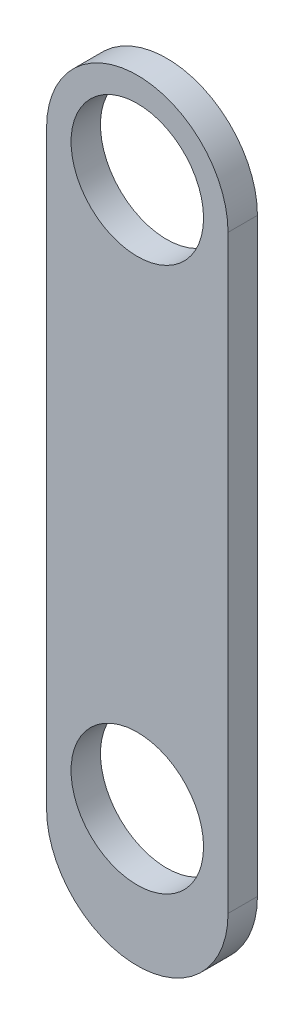
ISO-10303-21;
HEADER;
FILE_DESCRIPTION(('STEP AP214'),'2;1');
FILE_NAME('part.step','',(''),(''),'','','');
FILE_SCHEMA(('AUTOMOTIVE_DESIGN { 1 0 10303 214 1 1 1 1 }'));
ENDSEC;
DATA;
#1=APPLICATION_CONTEXT('core data for automotive mechanical design processes');
#2=APPLICATION_PROTOCOL_DEFINITION('international standard','automotive_design',2000,#1);
#3=PRODUCT_CONTEXT('',#1,'mechanical');
#4=PRODUCT('Part','Part','',(#3));
#5=PRODUCT_RELATED_PRODUCT_CATEGORY('part','',(#4));
#6=PRODUCT_DEFINITION_FORMATION('','',#4);
#7=PRODUCT_DEFINITION_CONTEXT('part definition',#1,'design');
#8=PRODUCT_DEFINITION('design','',#6,#7);
#9=PRODUCT_DEFINITION_SHAPE('','',#8);
#10=(LENGTH_UNIT() NAMED_UNIT(*) SI_UNIT(.MILLI.,.METRE.));
#11=(NAMED_UNIT(*) PLANE_ANGLE_UNIT() SI_UNIT($,.RADIAN.));
#12=(NAMED_UNIT(*) SI_UNIT($,.STERADIAN.) SOLID_ANGLE_UNIT());
#13=UNCERTAINTY_MEASURE_WITH_UNIT(LENGTH_MEASURE(1.E-05),#10,'distance_accuracy_value','');
#14=(GEOMETRIC_REPRESENTATION_CONTEXT(3) GLOBAL_UNCERTAINTY_ASSIGNED_CONTEXT((#13)) GLOBAL_UNIT_ASSIGNED_CONTEXT((#10,
#11,#12)) REPRESENTATION_CONTEXT('',''));
#15=CARTESIAN_POINT('',(0.,0.,0.));
#16=DIRECTION('',(0.,0.,1.));
#17=DIRECTION('',(1.,0.,0.));
#18=AXIS2_PLACEMENT_3D('',#15,#16,#17);
#19=CARTESIAN_POINT('',(12.7,0.,4.1148));
#20=DIRECTION('',(0.,0.,1.));
#21=DIRECTION('',(1.,0.,0.));
#22=AXIS2_PLACEMENT_3D('',#19,#20,#21);
#23=PLANE('',#22);
#24=CARTESIAN_POINT('',(12.7,6.34999999999999,4.1148));
#25=DIRECTION('',(0.,0.,1.));
#26=DIRECTION('',(1.,0.,0.));
#27=AXIS2_PLACEMENT_3D('',#24,#25,#26);
#28=CIRCLE('',#27,9.27099999999999);
#29=CARTESIAN_POINT('',(21.971,6.34999999999999,4.1148));
#30=VERTEX_POINT('',#29);
#31=EDGE_CURVE('E111',#30,#30,#28,.T.);
#32=ORIENTED_EDGE('',*,*,#31,.F.);
#33=EDGE_LOOP('',(#32));
#34=FACE_BOUND('',#33,.T.);
#35=CARTESIAN_POINT('',(12.7,0.,4.1148));
#36=DIRECTION('',(0.,0.,1.));
#37=DIRECTION('',(1.,0.,0.));
#38=AXIS2_PLACEMENT_3D('',#35,#36,#37);
#39=CIRCLE('',#38,12.7);
#40=CARTESIAN_POINT('',(0.,0.,4.1148));
#41=VERTEX_POINT('',#40);
#42=CARTESIAN_POINT('',(25.4,0.,4.1148));
#43=VERTEX_POINT('',#42);
#44=EDGE_CURVE('E96',#41,#43,#39,.T.);
#45=ORIENTED_EDGE('',*,*,#44,.T.);
#46=DIRECTION('',(0.,1.,0.));
#47=VECTOR('',#46,1.);
#48=CARTESIAN_POINT('',(25.4,0.,4.1148));
#49=LINE('',#48,#47);
#50=CARTESIAN_POINT('',(25.4,82.55,4.1148));
#51=VERTEX_POINT('',#50);
#52=EDGE_CURVE('E91',#43,#51,#49,.T.);
#53=ORIENTED_EDGE('',*,*,#52,.T.);
#54=CARTESIAN_POINT('',(12.7,82.55,4.1148));
#55=DIRECTION('',(0.,0.,1.));
#56=DIRECTION('',(1.,0.,0.));
#57=AXIS2_PLACEMENT_3D('',#54,#55,#56);
#58=CIRCLE('',#57,12.7);
#59=CARTESIAN_POINT('',(0.,82.55,4.1148));
#60=VERTEX_POINT('',#59);
#61=EDGE_CURVE('E94',#51,#60,#58,.T.);
#62=ORIENTED_EDGE('',*,*,#61,.T.);
#63=DIRECTION('',(0.,-1.,0.));
#64=VECTOR('',#63,1.);
#65=CARTESIAN_POINT('',(0.,0.,4.1148));
#66=LINE('',#65,#64);
#67=EDGE_CURVE('E61',#60,#41,#66,.T.);
#68=ORIENTED_EDGE('',*,*,#67,.T.);
#69=EDGE_LOOP('',(#45,#53,#62,#68));
#70=FACE_BOUND('',#69,.T.);
#71=CARTESIAN_POINT('',(12.7,82.55,4.1148));
#72=DIRECTION('',(0.,0.,1.));
#73=DIRECTION('',(1.,0.,0.));
#74=AXIS2_PLACEMENT_3D('',#71,#72,#73);
#75=CIRCLE('',#74,9.271);
#76=CARTESIAN_POINT('',(21.971,82.55,4.1148));
#77=VERTEX_POINT('',#76);
#78=EDGE_CURVE('E126',#77,#77,#75,.T.);
#79=ORIENTED_EDGE('',*,*,#78,.F.);
#80=EDGE_LOOP('',(#79));
#81=FACE_BOUND('',#80,.T.);
#82=ADVANCED_FACE('F44',(#34,#70,#81),#23,.T.);
#83=CARTESIAN_POINT('',(12.7,0.,0.));
#84=DIRECTION('',(0.,0.,1.));
#85=DIRECTION('',(1.,0.,0.));
#86=AXIS2_PLACEMENT_3D('',#83,#84,#85);
#87=PLANE('',#86);
#88=CARTESIAN_POINT('',(12.7,0.,0.));
#89=DIRECTION('',(0.,0.,1.));
#90=DIRECTION('',(1.,0.,0.));
#91=AXIS2_PLACEMENT_3D('',#88,#89,#90);
#92=CIRCLE('',#91,12.7);
#93=CARTESIAN_POINT('',(0.,0.,0.));
#94=VERTEX_POINT('',#93);
#95=CARTESIAN_POINT('',(25.4,0.,0.));
#96=VERTEX_POINT('',#95);
#97=EDGE_CURVE('E108',#94,#96,#92,.T.);
#98=ORIENTED_EDGE('',*,*,#97,.F.);
#99=DIRECTION('',(0.,-1.,0.));
#100=VECTOR('',#99,1.);
#101=CARTESIAN_POINT('',(0.,0.,0.));
#102=LINE('',#101,#100);
#103=CARTESIAN_POINT('',(0.,82.55,0.));
#104=VERTEX_POINT('',#103);
#105=EDGE_CURVE('E84',#104,#94,#102,.T.);
#106=ORIENTED_EDGE('',*,*,#105,.F.);
#107=CARTESIAN_POINT('',(12.7,82.55,0.));
#108=DIRECTION('',(0.,0.,1.));
#109=DIRECTION('',(1.,0.,0.));
#110=AXIS2_PLACEMENT_3D('',#107,#108,#109);
#111=CIRCLE('',#110,12.7);
#112=CARTESIAN_POINT('',(25.4,82.55,0.));
#113=VERTEX_POINT('',#112);
#114=EDGE_CURVE('E78',#113,#104,#111,.T.);
#115=ORIENTED_EDGE('',*,*,#114,.F.);
#116=DIRECTION('',(0.,1.,0.));
#117=VECTOR('',#116,1.);
#118=CARTESIAN_POINT('',(25.4,0.,0.));
#119=LINE('',#118,#117);
#120=EDGE_CURVE('E100',#96,#113,#119,.T.);
#121=ORIENTED_EDGE('',*,*,#120,.F.);
#122=EDGE_LOOP('',(#98,#106,#115,#121));
#123=FACE_BOUND('',#122,.T.);
#124=CARTESIAN_POINT('',(12.7,6.34999999999999,0.));
#125=DIRECTION('',(0.,0.,1.));
#126=DIRECTION('',(1.,0.,0.));
#127=AXIS2_PLACEMENT_3D('',#124,#125,#126);
#128=CIRCLE('',#127,9.27099999999999);
#129=CARTESIAN_POINT('',(21.971,6.34999999999999,0.));
#130=VERTEX_POINT('',#129);
#131=EDGE_CURVE('E123',#130,#130,#128,.T.);
#132=ORIENTED_EDGE('',*,*,#131,.T.);
#133=EDGE_LOOP('',(#132));
#134=FACE_BOUND('',#133,.T.);
#135=CARTESIAN_POINT('',(12.7,82.55,0.));
#136=DIRECTION('',(0.,0.,1.));
#137=DIRECTION('',(1.,0.,0.));
#138=AXIS2_PLACEMENT_3D('',#135,#136,#137);
#139=CIRCLE('',#138,9.271);
#140=CARTESIAN_POINT('',(21.971,82.55,0.));
#141=VERTEX_POINT('',#140);
#142=EDGE_CURVE('E129',#141,#141,#139,.T.);
#143=ORIENTED_EDGE('',*,*,#142,.T.);
#144=EDGE_LOOP('',(#143));
#145=FACE_BOUND('',#144,.T.);
#146=ADVANCED_FACE('F119',(#123,#134,#145),#87,.F.);
#147=CARTESIAN_POINT('',(12.7,0.,4.1148));
#148=DIRECTION('',(0.,0.,-1.));
#149=DIRECTION('',(-1.,0.,0.));
#150=AXIS2_PLACEMENT_3D('',#147,#148,#149);
#151=CYLINDRICAL_SURFACE('',#150,12.7);
#152=ORIENTED_EDGE('',*,*,#97,.T.);
#153=DIRECTION('',(0.,0.,-1.));
#154=VECTOR('',#153,1.);
#155=CARTESIAN_POINT('',(25.4,0.,4.1148));
#156=LINE('',#155,#154);
#157=EDGE_CURVE('E11',#43,#96,#156,.T.);
#158=ORIENTED_EDGE('',*,*,#157,.F.);
#159=ORIENTED_EDGE('',*,*,#44,.F.);
#160=DIRECTION('',(0.,0.,-1.));
#161=VECTOR('',#160,1.);
#162=CARTESIAN_POINT('',(0.,0.,4.1148));
#163=LINE('',#162,#161);
#164=EDGE_CURVE('E104',#41,#94,#163,.T.);
#165=ORIENTED_EDGE('',*,*,#164,.T.);
#166=EDGE_LOOP('',(#152,#158,#159,#165));
#167=FACE_BOUND('',#166,.T.);
#168=ADVANCED_FACE('F46',(#167),#151,.T.);
#169=CARTESIAN_POINT('',(25.4,0.,4.1148));
#170=DIRECTION('',(-1.,0.,0.));
#171=DIRECTION('',(0.,-1.,0.));
#172=AXIS2_PLACEMENT_3D('',#169,#170,#171);
#173=PLANE('',#172);
#174=ORIENTED_EDGE('',*,*,#120,.T.);
#175=DIRECTION('',(0.,0.,-1.));
#176=VECTOR('',#175,1.);
#177=CARTESIAN_POINT('',(25.4,82.55,4.1148));
#178=LINE('',#177,#176);
#179=EDGE_CURVE('E53',#51,#113,#178,.T.);
#180=ORIENTED_EDGE('',*,*,#179,.F.);
#181=ORIENTED_EDGE('',*,*,#52,.F.);
#182=ORIENTED_EDGE('',*,*,#157,.T.);
#183=EDGE_LOOP('',(#174,#180,#181,#182));
#184=FACE_BOUND('',#183,.T.);
#185=ADVANCED_FACE('F99',(#184),#173,.F.);
#186=CARTESIAN_POINT('',(12.7,82.55,4.1148));
#187=DIRECTION('',(0.,0.,-1.));
#188=DIRECTION('',(-1.,0.,0.));
#189=AXIS2_PLACEMENT_3D('',#186,#187,#188);
#190=CYLINDRICAL_SURFACE('',#189,12.7);
#191=ORIENTED_EDGE('',*,*,#114,.T.);
#192=DIRECTION('',(0.,0.,-1.));
#193=VECTOR('',#192,1.);
#194=CARTESIAN_POINT('',(0.,82.55,4.1148));
#195=LINE('',#194,#193);
#196=EDGE_CURVE('E101',#60,#104,#195,.T.);
#197=ORIENTED_EDGE('',*,*,#196,.F.);
#198=ORIENTED_EDGE('',*,*,#61,.F.);
#199=ORIENTED_EDGE('',*,*,#179,.T.);
#200=EDGE_LOOP('',(#191,#197,#198,#199));
#201=FACE_BOUND('',#200,.T.);
#202=ADVANCED_FACE('F102',(#201),#190,.T.);
#203=CARTESIAN_POINT('',(0.,0.,4.1148));
#204=DIRECTION('',(1.,0.,0.));
#205=DIRECTION('',(0.,0.,-1.));
#206=AXIS2_PLACEMENT_3D('',#203,#204,#205);
#207=PLANE('',#206);
#208=ORIENTED_EDGE('',*,*,#105,.T.);
#209=ORIENTED_EDGE('',*,*,#164,.F.);
#210=ORIENTED_EDGE('',*,*,#67,.F.);
#211=ORIENTED_EDGE('',*,*,#196,.T.);
#212=EDGE_LOOP('',(#208,#209,#210,#211));
#213=FACE_BOUND('',#212,.T.);
#214=ADVANCED_FACE('F116',(#213),#207,.F.);
#215=CARTESIAN_POINT('',(12.7,6.34999999999999,4.1148));
#216=DIRECTION('',(0.,0.,-1.));
#217=DIRECTION('',(-1.,0.,0.));
#218=AXIS2_PLACEMENT_3D('',#215,#216,#217);
#219=CYLINDRICAL_SURFACE('',#218,9.27099999999999);
#220=ORIENTED_EDGE('',*,*,#31,.T.);
#221=EDGE_LOOP('',(#220));
#222=FACE_BOUND('',#221,.T.);
#223=ORIENTED_EDGE('',*,*,#131,.F.);
#224=EDGE_LOOP('',(#223));
#225=FACE_BOUND('',#224,.T.);
#226=ADVANCED_FACE('F146',(#222,#225),#219,.F.);
#227=CARTESIAN_POINT('',(12.7,82.55,4.1148));
#228=DIRECTION('',(0.,0.,-1.));
#229=DIRECTION('',(-1.,0.,0.));
#230=AXIS2_PLACEMENT_3D('',#227,#228,#229);
#231=CYLINDRICAL_SURFACE('',#230,9.271);
#232=ORIENTED_EDGE('',*,*,#78,.T.);
#233=EDGE_LOOP('',(#232));
#234=FACE_BOUND('',#233,.T.);
#235=ORIENTED_EDGE('',*,*,#142,.F.);
#236=EDGE_LOOP('',(#235));
#237=FACE_BOUND('',#236,.T.);
#238=ADVANCED_FACE('F135',(#234,#237),#231,.F.);
#239=CLOSED_SHELL('',(#82,#146,#168,#185,#202,#214,#226,#238));
#240=MANIFOLD_SOLID_BREP('B2',#239);
#241=ADVANCED_BREP_SHAPE_REPRESENTATION('',(#18,#240),#14);
#242=SHAPE_DEFINITION_REPRESENTATION(#9,#241);
ENDSEC;
END-ISO-10303-21;
